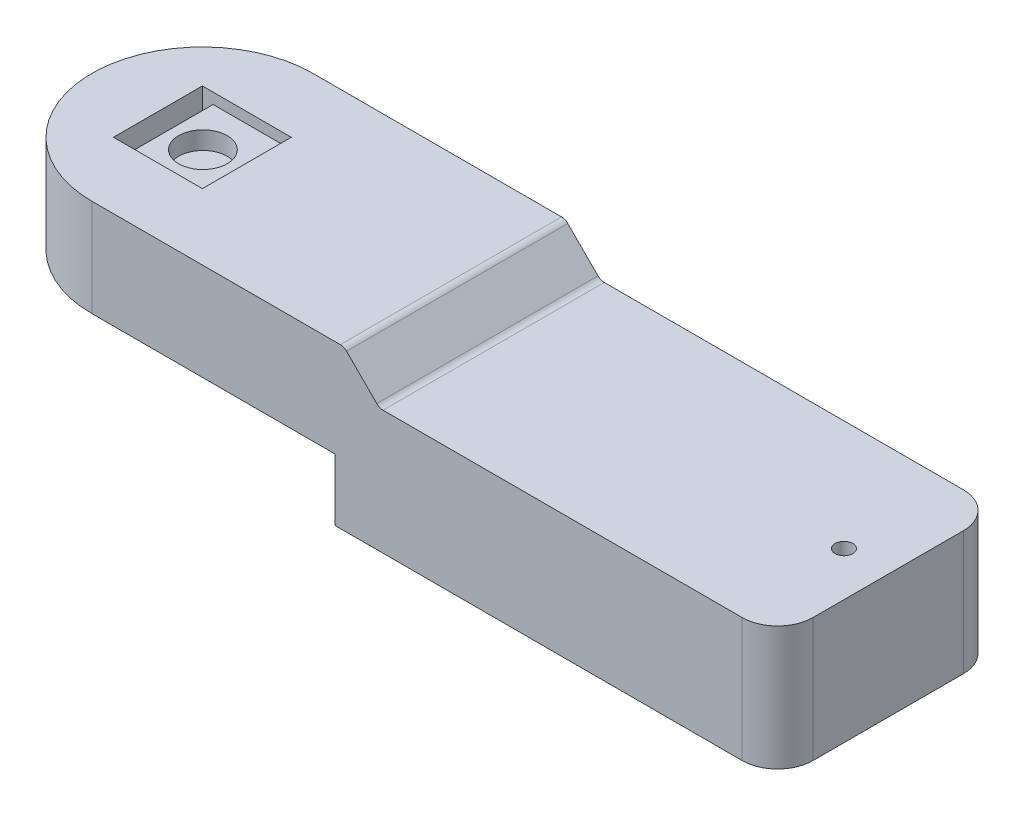
ISO-10303-21;
HEADER;
FILE_DESCRIPTION(('STEP AP214'),'2;1');
FILE_NAME('part.step','',(''),(''),'','','');
FILE_SCHEMA(('AUTOMOTIVE_DESIGN { 1 0 10303 214 1 1 1 1 }'));
ENDSEC;
DATA;
#1=APPLICATION_CONTEXT('core data for automotive mechanical design processes');
#2=APPLICATION_PROTOCOL_DEFINITION('international standard','automotive_design',2000,#1);
#3=PRODUCT_CONTEXT('',#1,'mechanical');
#4=PRODUCT('Part','Part','',(#3));
#5=PRODUCT_RELATED_PRODUCT_CATEGORY('part','',(#4));
#6=PRODUCT_DEFINITION_FORMATION('','',#4);
#7=PRODUCT_DEFINITION_CONTEXT('part definition',#1,'design');
#8=PRODUCT_DEFINITION('design','',#6,#7);
#9=PRODUCT_DEFINITION_SHAPE('','',#8);
#10=(LENGTH_UNIT() NAMED_UNIT(*) SI_UNIT(.MILLI.,.METRE.));
#11=(NAMED_UNIT(*) PLANE_ANGLE_UNIT() SI_UNIT($,.RADIAN.));
#12=(NAMED_UNIT(*) SI_UNIT($,.STERADIAN.) SOLID_ANGLE_UNIT());
#13=UNCERTAINTY_MEASURE_WITH_UNIT(LENGTH_MEASURE(1.E-05),#10,'distance_accuracy_value','');
#14=(GEOMETRIC_REPRESENTATION_CONTEXT(3) GLOBAL_UNCERTAINTY_ASSIGNED_CONTEXT((#13)) GLOBAL_UNIT_ASSIGNED_CONTEXT((#10,
#11,#12)) REPRESENTATION_CONTEXT('',''));
#15=CARTESIAN_POINT('',(0.,0.,0.));
#16=DIRECTION('',(0.,0.,1.));
#17=DIRECTION('',(1.,0.,0.));
#18=AXIS2_PLACEMENT_3D('',#15,#16,#17);
#19=CARTESIAN_POINT('',(-17.5,11.,0.));
#20=DIRECTION('',(0.,-1.,0.));
#21=DIRECTION('',(0.,0.,-1.));
#22=AXIS2_PLACEMENT_3D('',#19,#20,#21);
#23=CYLINDRICAL_SURFACE('',#22,12.5);
#24=DIRECTION('',(0.,-1.,0.));
#25=VECTOR('',#24,1.);
#26=CARTESIAN_POINT('',(-17.5,11.,12.5));
#27=LINE('',#26,#25);
#28=CARTESIAN_POINT('',(-17.5,11.,12.5));
#29=VERTEX_POINT('',#28);
#30=CARTESIAN_POINT('',(-17.5,0.,12.5));
#31=VERTEX_POINT('',#30);
#32=EDGE_CURVE('E296',#29,#31,#27,.T.);
#33=ORIENTED_EDGE('',*,*,#32,.F.);
#34=CARTESIAN_POINT('',(-17.5,11.,0.));
#35=DIRECTION('',(0.,1.,0.));
#36=DIRECTION('',(0.,0.,1.));
#37=AXIS2_PLACEMENT_3D('',#34,#35,#36);
#38=CIRCLE('',#37,12.5);
#39=CARTESIAN_POINT('',(-17.5,11.,-12.5));
#40=VERTEX_POINT('',#39);
#41=EDGE_CURVE('E302',#40,#29,#38,.T.);
#42=ORIENTED_EDGE('',*,*,#41,.F.);
#43=DIRECTION('',(0.,-1.,0.));
#44=VECTOR('',#43,1.);
#45=CARTESIAN_POINT('',(-17.5,11.,-12.5));
#46=LINE('',#45,#44);
#47=CARTESIAN_POINT('',(-17.5,0.,-12.5));
#48=VERTEX_POINT('',#47);
#49=EDGE_CURVE('E299',#48,#40,#46,.F.);
#50=ORIENTED_EDGE('',*,*,#49,.F.);
#51=CARTESIAN_POINT('',(-17.5,0.,0.));
#52=DIRECTION('',(0.,1.,0.));
#53=DIRECTION('',(0.,0.,1.));
#54=AXIS2_PLACEMENT_3D('',#51,#52,#53);
#55=CIRCLE('',#54,12.5);
#56=EDGE_CURVE('E304',#31,#48,#55,.F.);
#57=ORIENTED_EDGE('',*,*,#56,.F.);
#58=EDGE_LOOP('',(#33,#42,#50,#57));
#59=FACE_BOUND('',#58,.T.);
#60=ADVANCED_FACE('F37',(#59),#23,.T.);
#61=CARTESIAN_POINT('',(60.,11.,-12.5));
#62=DIRECTION('',(-1.,0.,0.));
#63=DIRECTION('',(0.,0.,1.));
#64=AXIS2_PLACEMENT_3D('',#61,#62,#63);
#65=PLANE('',#64);
#66=DIRECTION('',(0.,0.,1.));
#67=VECTOR('',#66,1.);
#68=CARTESIAN_POINT('',(60.,-7.,12.5));
#69=LINE('',#68,#67);
#70=CARTESIAN_POINT('',(60.,-7.,-8.5));
#71=VERTEX_POINT('',#70);
#72=CARTESIAN_POINT('',(60.,-7.,8.5));
#73=VERTEX_POINT('',#72);
#74=EDGE_CURVE('E267',#71,#73,#69,.T.);
#75=ORIENTED_EDGE('',*,*,#74,.F.);
#76=DIRECTION('',(0.,-1.,0.));
#77=VECTOR('',#76,1.);
#78=CARTESIAN_POINT('',(60.,11.,-8.5));
#79=LINE('',#78,#77);
#80=CARTESIAN_POINT('',(60.,7.,-8.5));
#81=VERTEX_POINT('',#80);
#82=EDGE_CURVE('E58',#71,#81,#79,.F.);
#83=ORIENTED_EDGE('',*,*,#82,.T.);
#84=DIRECTION('',(0.,0.,-1.));
#85=VECTOR('',#84,1.);
#86=CARTESIAN_POINT('',(60.,7.,12.5));
#87=LINE('',#86,#85);
#88=CARTESIAN_POINT('',(60.,7.,8.5));
#89=VERTEX_POINT('',#88);
#90=EDGE_CURVE('E256',#89,#81,#87,.T.);
#91=ORIENTED_EDGE('',*,*,#90,.F.);
#92=DIRECTION('',(0.,-1.,0.));
#93=VECTOR('',#92,1.);
#94=CARTESIAN_POINT('',(60.,11.,8.5));
#95=LINE('',#94,#93);
#96=EDGE_CURVE('E332',#89,#73,#95,.T.);
#97=ORIENTED_EDGE('',*,*,#96,.T.);
#98=EDGE_LOOP('',(#75,#83,#91,#97));
#99=FACE_BOUND('',#98,.T.);
#100=ADVANCED_FACE('F350',(#99),#65,.F.);
#101=CARTESIAN_POINT('',(0.,0.,0.));
#102=DIRECTION('',(0.,1.,0.));
#103=DIRECTION('',(0.,0.,1.));
#104=AXIS2_PLACEMENT_3D('',#101,#102,#103);
#105=PLANE('',#104);
#106=CARTESIAN_POINT('',(-17.5,0.,0.));
#107=DIRECTION('',(0.,-1.,0.));
#108=DIRECTION('',(0.,0.,-1.));
#109=AXIS2_PLACEMENT_3D('',#106,#107,#108);
#110=CIRCLE('',#109,6.96);
#111=CARTESIAN_POINT('',(-17.5,0.,-6.96));
#112=VERTEX_POINT('',#111);
#113=EDGE_CURVE('E493',#112,#112,#110,.T.);
#114=ORIENTED_EDGE('',*,*,#113,.F.);
#115=EDGE_LOOP('',(#114));
#116=FACE_BOUND('',#115,.T.);
#117=DIRECTION('',(1.,0.,0.));
#118=VECTOR('',#117,1.);
#119=CARTESIAN_POINT('',(-30.,0.,12.5));
#120=LINE('',#119,#118);
#121=CARTESIAN_POINT('',(9.99999999999998,0.,12.5));
#122=VERTEX_POINT('',#121);
#123=EDGE_CURVE('E280',#31,#122,#120,.T.);
#124=ORIENTED_EDGE('',*,*,#123,.F.);
#125=ORIENTED_EDGE('',*,*,#56,.T.);
#126=DIRECTION('',(-1.,0.,0.));
#127=VECTOR('',#126,1.);
#128=CARTESIAN_POINT('',(-30.,0.,-12.5));
#129=LINE('',#128,#127);
#130=CARTESIAN_POINT('',(9.99999999999999,0.,-12.5));
#131=VERTEX_POINT('',#130);
#132=EDGE_CURVE('E285',#131,#48,#129,.T.);
#133=ORIENTED_EDGE('',*,*,#132,.F.);
#134=DIRECTION('',(0.,0.,-1.));
#135=VECTOR('',#134,1.);
#136=CARTESIAN_POINT('',(9.99999999999999,0.,-12.5));
#137=LINE('',#136,#135);
#138=EDGE_CURVE('E260',#122,#131,#137,.T.);
#139=ORIENTED_EDGE('',*,*,#138,.F.);
#140=EDGE_LOOP('',(#124,#125,#133,#139));
#141=FACE_BOUND('',#140,.T.);
#142=ADVANCED_FACE('F365',(#116,#141),#105,.F.);
#143=CARTESIAN_POINT('',(-30.,11.,12.5));
#144=DIRECTION('',(0.,0.,-1.));
#145=DIRECTION('',(-1.,0.,0.));
#146=AXIS2_PLACEMENT_3D('',#143,#144,#145);
#147=PLANE('',#146);
#148=DIRECTION('',(-1.,0.,0.));
#149=VECTOR('',#148,1.);
#150=CARTESIAN_POINT('',(9.99999999999999,-7.,12.5));
#151=LINE('',#150,#149);
#152=CARTESIAN_POINT('',(56.,-7.,12.5));
#153=VERTEX_POINT('',#152);
#154=CARTESIAN_POINT('',(9.99999999999999,-7.,12.5));
#155=VERTEX_POINT('',#154);
#156=EDGE_CURVE('E270',#153,#155,#151,.T.);
#157=ORIENTED_EDGE('',*,*,#156,.F.);
#158=DIRECTION('',(0.,-1.,0.));
#159=VECTOR('',#158,1.);
#160=CARTESIAN_POINT('',(56.,11.,12.5));
#161=LINE('',#160,#159);
#162=CARTESIAN_POINT('',(56.,7.,12.5));
#163=VERTEX_POINT('',#162);
#164=EDGE_CURVE('E11',#153,#163,#161,.F.);
#165=ORIENTED_EDGE('',*,*,#164,.T.);
#166=DIRECTION('',(1.,0.,0.));
#167=VECTOR('',#166,1.);
#168=CARTESIAN_POINT('',(15.,7.,12.5));
#169=LINE('',#168,#167);
#170=CARTESIAN_POINT('',(15.4142135623731,7.,12.5));
#171=VERTEX_POINT('',#170);
#172=EDGE_CURVE('E248',#171,#163,#169,.T.);
#173=ORIENTED_EDGE('',*,*,#172,.F.);
#174=CARTESIAN_POINT('',(15.4142135623731,8.,12.5));
#175=DIRECTION('',(0.,0.,-1.));
#176=DIRECTION('',(-1.,0.,0.));
#177=AXIS2_PLACEMENT_3D('',#174,#175,#176);
#178=CIRCLE('',#177,1.);
#179=CARTESIAN_POINT('',(14.7071067811865,7.29289321881345,12.5));
#180=VERTEX_POINT('',#179);
#181=EDGE_CURVE('E320',#171,#180,#178,.T.);
#182=ORIENTED_EDGE('',*,*,#181,.T.);
#183=DIRECTION('',(-0.707106781186548,0.707106781186547,0.));
#184=VECTOR('',#183,1.);
#185=CARTESIAN_POINT('',(15.,6.99999999999998,12.5));
#186=LINE('',#185,#184);
#187=CARTESIAN_POINT('',(11.2928932188134,10.7071067811865,12.5));
#188=VERTEX_POINT('',#187);
#189=EDGE_CURVE('E287',#180,#188,#186,.T.);
#190=ORIENTED_EDGE('',*,*,#189,.T.);
#191=CARTESIAN_POINT('',(10.5857864376269,10.,12.5));
#192=DIRECTION('',(0.,0.,-1.));
#193=DIRECTION('',(-1.,0.,0.));
#194=AXIS2_PLACEMENT_3D('',#191,#192,#193);
#195=CIRCLE('',#194,1.);
#196=CARTESIAN_POINT('',(10.5857864376269,11.,12.5));
#197=VERTEX_POINT('',#196);
#198=EDGE_CURVE('E318',#188,#197,#195,.F.);
#199=ORIENTED_EDGE('',*,*,#198,.T.);
#200=DIRECTION('',(1.,0.,0.));
#201=VECTOR('',#200,1.);
#202=CARTESIAN_POINT('',(-30.,11.,12.5));
#203=LINE('',#202,#201);
#204=EDGE_CURVE('E281',#29,#197,#203,.T.);
#205=ORIENTED_EDGE('',*,*,#204,.F.);
#206=ORIENTED_EDGE('',*,*,#32,.T.);
#207=ORIENTED_EDGE('',*,*,#123,.T.);
#208=DIRECTION('',(0.,1.,0.));
#209=VECTOR('',#208,1.);
#210=CARTESIAN_POINT('',(9.99999999999999,-7.,12.5));
#211=LINE('',#210,#209);
#212=EDGE_CURVE('E272',#155,#122,#211,.T.);
#213=ORIENTED_EDGE('',*,*,#212,.F.);
#214=EDGE_LOOP('',(#157,#165,#173,#182,#190,#199,#205,#206,#207,#213));
#215=FACE_BOUND('',#214,.T.);
#216=ADVANCED_FACE('F355',(#215),#147,.F.);
#217=CARTESIAN_POINT('',(-30.,11.,-12.5));
#218=DIRECTION('',(0.,0.,1.));
#219=DIRECTION('',(1.,0.,0.));
#220=AXIS2_PLACEMENT_3D('',#217,#218,#219);
#221=PLANE('',#220);
#222=DIRECTION('',(-1.,0.,0.));
#223=VECTOR('',#222,1.);
#224=CARTESIAN_POINT('',(60.,7.,-12.5));
#225=LINE('',#224,#223);
#226=CARTESIAN_POINT('',(56.,7.,-12.5));
#227=VERTEX_POINT('',#226);
#228=CARTESIAN_POINT('',(15.4142135623731,7.,-12.5));
#229=VERTEX_POINT('',#228);
#230=EDGE_CURVE('E258',#227,#229,#225,.T.);
#231=ORIENTED_EDGE('',*,*,#230,.F.);
#232=DIRECTION('',(0.,-1.,0.));
#233=VECTOR('',#232,1.);
#234=CARTESIAN_POINT('',(56.,11.,-12.5));
#235=LINE('',#234,#233);
#236=CARTESIAN_POINT('',(56.,-7.,-12.5));
#237=VERTEX_POINT('',#236);
#238=EDGE_CURVE('E325',#227,#237,#235,.T.);
#239=ORIENTED_EDGE('',*,*,#238,.T.);
#240=DIRECTION('',(1.,0.,0.));
#241=VECTOR('',#240,1.);
#242=CARTESIAN_POINT('',(60.,-7.,-12.5));
#243=LINE('',#242,#241);
#244=CARTESIAN_POINT('',(9.99999999999999,-7.,-12.5));
#245=VERTEX_POINT('',#244);
#246=EDGE_CURVE('E264',#245,#237,#243,.T.);
#247=ORIENTED_EDGE('',*,*,#246,.F.);
#248=DIRECTION('',(0.,1.,0.));
#249=VECTOR('',#248,1.);
#250=CARTESIAN_POINT('',(9.99999999999999,-7.,-12.5));
#251=LINE('',#250,#249);
#252=EDGE_CURVE('E277',#245,#131,#251,.T.);
#253=ORIENTED_EDGE('',*,*,#252,.T.);
#254=ORIENTED_EDGE('',*,*,#132,.T.);
#255=ORIENTED_EDGE('',*,*,#49,.T.);
#256=DIRECTION('',(-1.,0.,0.));
#257=VECTOR('',#256,1.);
#258=CARTESIAN_POINT('',(-30.,11.,-12.5));
#259=LINE('',#258,#257);
#260=CARTESIAN_POINT('',(10.5857864376269,11.,-12.5));
#261=VERTEX_POINT('',#260);
#262=EDGE_CURVE('E284',#261,#40,#259,.T.);
#263=ORIENTED_EDGE('',*,*,#262,.F.);
#264=CARTESIAN_POINT('',(10.5857864376269,10.,-12.5));
#265=DIRECTION('',(0.,0.,1.));
#266=DIRECTION('',(1.,0.,0.));
#267=AXIS2_PLACEMENT_3D('',#264,#265,#266);
#268=CIRCLE('',#267,1.);
#269=CARTESIAN_POINT('',(11.2928932188134,10.7071067811865,-12.5));
#270=VERTEX_POINT('',#269);
#271=EDGE_CURVE('E316',#261,#270,#268,.F.);
#272=ORIENTED_EDGE('',*,*,#271,.T.);
#273=DIRECTION('',(0.707106781186548,-0.707106781186547,0.));
#274=VECTOR('',#273,1.);
#275=CARTESIAN_POINT('',(15.,6.99999999999998,-12.5));
#276=LINE('',#275,#274);
#277=CARTESIAN_POINT('',(14.7071067811865,7.29289321881345,-12.5));
#278=VERTEX_POINT('',#277);
#279=EDGE_CURVE('E293',#270,#278,#276,.T.);
#280=ORIENTED_EDGE('',*,*,#279,.T.);
#281=CARTESIAN_POINT('',(15.4142135623731,8.,-12.5));
#282=DIRECTION('',(0.,0.,1.));
#283=DIRECTION('',(1.,0.,0.));
#284=AXIS2_PLACEMENT_3D('',#281,#282,#283);
#285=CIRCLE('',#284,1.);
#286=EDGE_CURVE('E322',#278,#229,#285,.T.);
#287=ORIENTED_EDGE('',*,*,#286,.T.);
#288=EDGE_LOOP('',(#231,#239,#247,#253,#254,#255,#263,#272,#280,#287));
#289=FACE_BOUND('',#288,.T.);
#290=ADVANCED_FACE('F344',(#289),#221,.F.);
#291=CARTESIAN_POINT('',(0.,11.,0.));
#292=DIRECTION('',(0.,1.,0.));
#293=DIRECTION('',(0.,0.,1.));
#294=AXIS2_PLACEMENT_3D('',#291,#292,#293);
#295=PLANE('',#294);
#296=DIRECTION('',(0.,0.,1.));
#297=VECTOR('',#296,1.);
#298=CARTESIAN_POINT('',(-22.525,11.,-5.025));
#299=LINE('',#298,#297);
#300=CARTESIAN_POINT('',(-22.525,11.,-5.025));
#301=VERTEX_POINT('',#300);
#302=CARTESIAN_POINT('',(-22.525,11.,5.025));
#303=VERTEX_POINT('',#302);
#304=EDGE_CURVE('E211',#301,#303,#299,.T.);
#305=ORIENTED_EDGE('',*,*,#304,.F.);
#306=DIRECTION('',(-1.,0.,0.));
#307=VECTOR('',#306,1.);
#308=CARTESIAN_POINT('',(-22.525,11.,-5.025));
#309=LINE('',#308,#307);
#310=CARTESIAN_POINT('',(-12.475,11.,-5.025));
#311=VERTEX_POINT('',#310);
#312=EDGE_CURVE('E235',#311,#301,#309,.T.);
#313=ORIENTED_EDGE('',*,*,#312,.F.);
#314=DIRECTION('',(0.,0.,-1.));
#315=VECTOR('',#314,1.);
#316=CARTESIAN_POINT('',(-12.475,11.,-5.025));
#317=LINE('',#316,#315);
#318=CARTESIAN_POINT('',(-12.475,11.,5.025));
#319=VERTEX_POINT('',#318);
#320=EDGE_CURVE('E242',#319,#311,#317,.T.);
#321=ORIENTED_EDGE('',*,*,#320,.F.);
#322=DIRECTION('',(1.,0.,0.));
#323=VECTOR('',#322,1.);
#324=CARTESIAN_POINT('',(-22.525,11.,5.025));
#325=LINE('',#324,#323);
#326=EDGE_CURVE('E239',#303,#319,#325,.T.);
#327=ORIENTED_EDGE('',*,*,#326,.F.);
#328=EDGE_LOOP('',(#305,#313,#321,#327));
#329=FACE_BOUND('',#328,.T.);
#330=ORIENTED_EDGE('',*,*,#204,.T.);
#331=DIRECTION('',(0.,0.,-1.));
#332=VECTOR('',#331,1.);
#333=CARTESIAN_POINT('',(10.5857864376269,11.,0.));
#334=LINE('',#333,#332);
#335=EDGE_CURVE('E313',#197,#261,#334,.T.);
#336=ORIENTED_EDGE('',*,*,#335,.T.);
#337=ORIENTED_EDGE('',*,*,#262,.T.);
#338=ORIENTED_EDGE('',*,*,#41,.T.);
#339=EDGE_LOOP('',(#330,#336,#337,#338));
#340=FACE_BOUND('',#339,.T.);
#341=ADVANCED_FACE('F371',(#329,#340),#295,.T.);
#342=CARTESIAN_POINT('',(9.99999999999999,-7.,-12.5));
#343=DIRECTION('',(1.,0.,0.));
#344=DIRECTION('',(0.,0.,-1.));
#345=AXIS2_PLACEMENT_3D('',#342,#343,#344);
#346=PLANE('',#345);
#347=ORIENTED_EDGE('',*,*,#138,.T.);
#348=ORIENTED_EDGE('',*,*,#252,.F.);
#349=DIRECTION('',(0.,0.,-1.));
#350=VECTOR('',#349,1.);
#351=CARTESIAN_POINT('',(9.99999999999999,-7.,-12.5));
#352=LINE('',#351,#350);
#353=EDGE_CURVE('E261',#155,#245,#352,.T.);
#354=ORIENTED_EDGE('',*,*,#353,.F.);
#355=ORIENTED_EDGE('',*,*,#212,.T.);
#356=EDGE_LOOP('',(#347,#348,#354,#355));
#357=FACE_BOUND('',#356,.T.);
#358=ADVANCED_FACE('F361',(#357),#346,.F.);
#359=CARTESIAN_POINT('',(0.,-7.,0.));
#360=DIRECTION('',(0.,1.,0.));
#361=DIRECTION('',(0.,0.,1.));
#362=AXIS2_PLACEMENT_3D('',#359,#360,#361);
#363=PLANE('',#362);
#364=CARTESIAN_POINT('',(55.,-7.,0.));
#365=DIRECTION('',(0.,1.,0.));
#366=DIRECTION('',(0.,0.,1.));
#367=AXIS2_PLACEMENT_3D('',#364,#365,#366);
#368=CIRCLE('',#367,0.999999999999998);
#369=CARTESIAN_POINT('',(55.,-7.,0.999999999999998));
#370=VERTEX_POINT('',#369);
#371=EDGE_CURVE('E482',#370,#370,#368,.T.);
#372=ORIENTED_EDGE('',*,*,#371,.T.);
#373=EDGE_LOOP('',(#372));
#374=FACE_BOUND('',#373,.T.);
#375=ORIENTED_EDGE('',*,*,#246,.T.);
#376=CARTESIAN_POINT('',(56.,-7.,-8.5));
#377=DIRECTION('',(0.,1.,0.));
#378=DIRECTION('',(0.,0.,1.));
#379=AXIS2_PLACEMENT_3D('',#376,#377,#378);
#380=CIRCLE('',#379,4.);
#381=EDGE_CURVE('E330',#237,#71,#380,.F.);
#382=ORIENTED_EDGE('',*,*,#381,.T.);
#383=ORIENTED_EDGE('',*,*,#74,.T.);
#384=CARTESIAN_POINT('',(56.,-7.,8.5));
#385=DIRECTION('',(0.,1.,0.));
#386=DIRECTION('',(0.,0.,1.));
#387=AXIS2_PLACEMENT_3D('',#384,#385,#386);
#388=CIRCLE('',#387,4.);
#389=EDGE_CURVE('E328',#73,#153,#388,.F.);
#390=ORIENTED_EDGE('',*,*,#389,.T.);
#391=ORIENTED_EDGE('',*,*,#156,.T.);
#392=ORIENTED_EDGE('',*,*,#353,.T.);
#393=EDGE_LOOP('',(#375,#382,#383,#390,#391,#392));
#394=FACE_BOUND('',#393,.T.);
#395=ADVANCED_FACE('F349',(#374,#394),#363,.F.);
#396=CARTESIAN_POINT('',(0.,7.,0.));
#397=DIRECTION('',(0.,1.,0.));
#398=DIRECTION('',(0.,0.,1.));
#399=AXIS2_PLACEMENT_3D('',#396,#397,#398);
#400=PLANE('',#399);
#401=CARTESIAN_POINT('',(55.,7.,0.));
#402=DIRECTION('',(0.,1.,0.));
#403=DIRECTION('',(0.,0.,1.));
#404=AXIS2_PLACEMENT_3D('',#401,#402,#403);
#405=CIRCLE('',#404,0.999999999999998);
#406=CARTESIAN_POINT('',(55.,7.,0.999999999999998));
#407=VERTEX_POINT('',#406);
#408=EDGE_CURVE('E485',#407,#407,#405,.T.);
#409=ORIENTED_EDGE('',*,*,#408,.F.);
#410=EDGE_LOOP('',(#409));
#411=FACE_BOUND('',#410,.T.);
#412=ORIENTED_EDGE('',*,*,#90,.T.);
#413=CARTESIAN_POINT('',(56.,7.,-8.5));
#414=DIRECTION('',(0.,1.,0.));
#415=DIRECTION('',(0.,0.,1.));
#416=AXIS2_PLACEMENT_3D('',#413,#414,#415);
#417=CIRCLE('',#416,4.);
#418=EDGE_CURVE('E45',#81,#227,#417,.T.);
#419=ORIENTED_EDGE('',*,*,#418,.T.);
#420=ORIENTED_EDGE('',*,*,#230,.T.);
#421=DIRECTION('',(0.,0.,1.));
#422=VECTOR('',#421,1.);
#423=CARTESIAN_POINT('',(15.4142135623731,7.,12.5));
#424=LINE('',#423,#422);
#425=EDGE_CURVE('E306',#229,#171,#424,.T.);
#426=ORIENTED_EDGE('',*,*,#425,.T.);
#427=ORIENTED_EDGE('',*,*,#172,.T.);
#428=CARTESIAN_POINT('',(56.,7.,8.5));
#429=DIRECTION('',(0.,1.,0.));
#430=DIRECTION('',(0.,0.,1.));
#431=AXIS2_PLACEMENT_3D('',#428,#429,#430);
#432=CIRCLE('',#431,4.);
#433=EDGE_CURVE('E336',#163,#89,#432,.T.);
#434=ORIENTED_EDGE('',*,*,#433,.T.);
#435=EDGE_LOOP('',(#412,#419,#420,#426,#427,#434));
#436=FACE_BOUND('',#435,.T.);
#437=ADVANCED_FACE('F340',(#411,#436),#400,.T.);
#438=CARTESIAN_POINT('',(-22.525,9.79,-5.025));
#439=DIRECTION('',(-1.,0.,0.));
#440=DIRECTION('',(0.,0.,1.));
#441=AXIS2_PLACEMENT_3D('',#438,#439,#440);
#442=PLANE('',#441);
#443=ORIENTED_EDGE('',*,*,#304,.T.);
#444=DIRECTION('',(0.,1.,0.));
#445=VECTOR('',#444,1.);
#446=CARTESIAN_POINT('',(-22.525,9.79,5.025));
#447=LINE('',#446,#445);
#448=CARTESIAN_POINT('',(-22.525,7.77,5.025));
#449=VERTEX_POINT('',#448);
#450=EDGE_CURVE('E237',#449,#303,#447,.T.);
#451=ORIENTED_EDGE('',*,*,#450,.F.);
#452=DIRECTION('',(0.,0.,1.));
#453=VECTOR('',#452,1.);
#454=CARTESIAN_POINT('',(-22.525,7.77,5.025));
#455=LINE('',#454,#453);
#456=CARTESIAN_POINT('',(-22.525,7.77,-5.025));
#457=VERTEX_POINT('',#456);
#458=EDGE_CURVE('E213',#457,#449,#455,.T.);
#459=ORIENTED_EDGE('',*,*,#458,.F.);
#460=DIRECTION('',(0.,1.,0.));
#461=VECTOR('',#460,1.);
#462=CARTESIAN_POINT('',(-22.525,9.79,-5.025));
#463=LINE('',#462,#461);
#464=EDGE_CURVE('E246',#457,#301,#463,.T.);
#465=ORIENTED_EDGE('',*,*,#464,.T.);
#466=EDGE_LOOP('',(#443,#451,#459,#465));
#467=FACE_BOUND('',#466,.T.);
#468=ADVANCED_FACE('F420',(#467),#442,.F.);
#469=CARTESIAN_POINT('',(-22.525,9.79,-5.025));
#470=DIRECTION('',(0.,0.,-1.));
#471=DIRECTION('',(-1.,0.,0.));
#472=AXIS2_PLACEMENT_3D('',#469,#470,#471);
#473=PLANE('',#472);
#474=ORIENTED_EDGE('',*,*,#312,.T.);
#475=ORIENTED_EDGE('',*,*,#464,.F.);
#476=DIRECTION('',(-1.,0.,0.));
#477=VECTOR('',#476,1.);
#478=CARTESIAN_POINT('',(-22.525,7.77,-5.025));
#479=LINE('',#478,#477);
#480=CARTESIAN_POINT('',(-21.315,7.77,-5.025));
#481=VERTEX_POINT('',#480);
#482=EDGE_CURVE('E223',#481,#457,#479,.T.);
#483=ORIENTED_EDGE('',*,*,#482,.F.);
#484=DIRECTION('',(0.,1.,0.));
#485=VECTOR('',#484,1.);
#486=CARTESIAN_POINT('',(-21.315,7.77,-5.025));
#487=LINE('',#486,#485);
#488=CARTESIAN_POINT('',(-21.315,9.79,-5.025));
#489=VERTEX_POINT('',#488);
#490=EDGE_CURVE('E203',#481,#489,#487,.T.);
#491=ORIENTED_EDGE('',*,*,#490,.T.);
#492=DIRECTION('',(-1.,0.,0.));
#493=VECTOR('',#492,1.);
#494=CARTESIAN_POINT('',(-22.525,9.79,-5.025));
#495=LINE('',#494,#493);
#496=CARTESIAN_POINT('',(-13.685,9.79,-5.025));
#497=VERTEX_POINT('',#496);
#498=EDGE_CURVE('E184',#497,#489,#495,.T.);
#499=ORIENTED_EDGE('',*,*,#498,.F.);
#500=DIRECTION('',(0.,1.,0.));
#501=VECTOR('',#500,1.);
#502=CARTESIAN_POINT('',(-13.685,7.77,-5.025));
#503=LINE('',#502,#501);
#504=CARTESIAN_POINT('',(-13.685,7.77,-5.025));
#505=VERTEX_POINT('',#504);
#506=EDGE_CURVE('E176',#505,#497,#503,.T.);
#507=ORIENTED_EDGE('',*,*,#506,.F.);
#508=DIRECTION('',(-1.,0.,0.));
#509=VECTOR('',#508,1.);
#510=CARTESIAN_POINT('',(-12.475,7.77,-5.025));
#511=LINE('',#510,#509);
#512=CARTESIAN_POINT('',(-12.475,7.77,-5.025));
#513=VERTEX_POINT('',#512);
#514=EDGE_CURVE('E181',#513,#505,#511,.T.);
#515=ORIENTED_EDGE('',*,*,#514,.F.);
#516=DIRECTION('',(0.,1.,0.));
#517=VECTOR('',#516,1.);
#518=CARTESIAN_POINT('',(-12.475,9.79,-5.025));
#519=LINE('',#518,#517);
#520=EDGE_CURVE('E249',#513,#311,#519,.T.);
#521=ORIENTED_EDGE('',*,*,#520,.T.);
#522=EDGE_LOOP('',(#474,#475,#483,#491,#499,#507,#515,#521));
#523=FACE_BOUND('',#522,.T.);
#524=ADVANCED_FACE('F179',(#523),#473,.F.);
#525=CARTESIAN_POINT('',(-12.475,9.79,-5.025));
#526=DIRECTION('',(1.,0.,0.));
#527=DIRECTION('',(0.,0.,-1.));
#528=AXIS2_PLACEMENT_3D('',#525,#526,#527);
#529=PLANE('',#528);
#530=ORIENTED_EDGE('',*,*,#320,.T.);
#531=ORIENTED_EDGE('',*,*,#520,.F.);
#532=DIRECTION('',(0.,0.,-1.));
#533=VECTOR('',#532,1.);
#534=CARTESIAN_POINT('',(-12.475,7.77,5.025));
#535=LINE('',#534,#533);
#536=CARTESIAN_POINT('',(-12.475,7.77,5.025));
#537=VERTEX_POINT('',#536);
#538=EDGE_CURVE('E189',#537,#513,#535,.T.);
#539=ORIENTED_EDGE('',*,*,#538,.F.);
#540=DIRECTION('',(0.,1.,0.));
#541=VECTOR('',#540,1.);
#542=CARTESIAN_POINT('',(-12.475,9.79,5.025));
#543=LINE('',#542,#541);
#544=EDGE_CURVE('E251',#537,#319,#543,.T.);
#545=ORIENTED_EDGE('',*,*,#544,.T.);
#546=EDGE_LOOP('',(#530,#531,#539,#545));
#547=FACE_BOUND('',#546,.T.);
#548=ADVANCED_FACE('F429',(#547),#529,.F.);
#549=CARTESIAN_POINT('',(-22.525,9.79,5.025));
#550=DIRECTION('',(0.,0.,1.));
#551=DIRECTION('',(1.,0.,0.));
#552=AXIS2_PLACEMENT_3D('',#549,#550,#551);
#553=PLANE('',#552);
#554=ORIENTED_EDGE('',*,*,#326,.T.);
#555=ORIENTED_EDGE('',*,*,#544,.F.);
#556=DIRECTION('',(1.,0.,0.));
#557=VECTOR('',#556,1.);
#558=CARTESIAN_POINT('',(-13.685,7.77,5.025));
#559=LINE('',#558,#557);
#560=CARTESIAN_POINT('',(-13.685,7.77,5.025));
#561=VERTEX_POINT('',#560);
#562=EDGE_CURVE('E197',#561,#537,#559,.T.);
#563=ORIENTED_EDGE('',*,*,#562,.F.);
#564=DIRECTION('',(0.,1.,0.));
#565=VECTOR('',#564,1.);
#566=CARTESIAN_POINT('',(-13.685,7.77,5.025));
#567=LINE('',#566,#565);
#568=CARTESIAN_POINT('',(-13.685,9.79,5.025));
#569=VERTEX_POINT('',#568);
#570=EDGE_CURVE('E188',#561,#569,#567,.T.);
#571=ORIENTED_EDGE('',*,*,#570,.T.);
#572=DIRECTION('',(1.,0.,0.));
#573=VECTOR('',#572,1.);
#574=CARTESIAN_POINT('',(-22.525,9.79,5.025));
#575=LINE('',#574,#573);
#576=CARTESIAN_POINT('',(-21.315,9.79,5.025));
#577=VERTEX_POINT('',#576);
#578=EDGE_CURVE('E232',#577,#569,#575,.T.);
#579=ORIENTED_EDGE('',*,*,#578,.F.);
#580=DIRECTION('',(0.,1.,0.));
#581=VECTOR('',#580,1.);
#582=CARTESIAN_POINT('',(-21.315,7.77,5.025));
#583=LINE('',#582,#581);
#584=CARTESIAN_POINT('',(-21.315,7.77,5.025));
#585=VERTEX_POINT('',#584);
#586=EDGE_CURVE('E226',#585,#577,#583,.T.);
#587=ORIENTED_EDGE('',*,*,#586,.F.);
#588=DIRECTION('',(1.,0.,0.));
#589=VECTOR('',#588,1.);
#590=CARTESIAN_POINT('',(-21.315,7.77,5.025));
#591=LINE('',#590,#589);
#592=EDGE_CURVE('E216',#449,#585,#591,.T.);
#593=ORIENTED_EDGE('',*,*,#592,.F.);
#594=ORIENTED_EDGE('',*,*,#450,.T.);
#595=EDGE_LOOP('',(#554,#555,#563,#571,#579,#587,#593,#594));
#596=FACE_BOUND('',#595,.T.);
#597=ADVANCED_FACE('F425',(#596),#553,.F.);
#598=CARTESIAN_POINT('',(0.,9.79,0.));
#599=DIRECTION('',(0.,1.,0.));
#600=DIRECTION('',(0.,0.,1.));
#601=AXIS2_PLACEMENT_3D('',#598,#599,#600);
#602=PLANE('',#601);
#603=CARTESIAN_POINT('',(-17.465,9.79,-0.0250000000000007));
#604=DIRECTION('',(0.,1.,0.));
#605=DIRECTION('',(0.,0.,1.));
#606=AXIS2_PLACEMENT_3D('',#603,#604,#605);
#607=CIRCLE('',#606,2.75);
#608=CARTESIAN_POINT('',(-17.465,9.79,2.725));
#609=VERTEX_POINT('',#608);
#610=EDGE_CURVE('E206',#609,#609,#607,.T.);
#611=ORIENTED_EDGE('',*,*,#610,.F.);
#612=EDGE_LOOP('',(#611));
#613=FACE_BOUND('',#612,.T.);
#614=DIRECTION('',(0.,0.,1.));
#615=VECTOR('',#614,1.);
#616=CARTESIAN_POINT('',(-13.685,9.79,-5.025));
#617=LINE('',#616,#615);
#618=EDGE_CURVE('E201',#497,#569,#617,.T.);
#619=ORIENTED_EDGE('',*,*,#618,.F.);
#620=ORIENTED_EDGE('',*,*,#498,.T.);
#621=DIRECTION('',(0.,0.,-1.));
#622=VECTOR('',#621,1.);
#623=CARTESIAN_POINT('',(-21.315,9.79,-5.025));
#624=LINE('',#623,#622);
#625=EDGE_CURVE('E217',#577,#489,#624,.T.);
#626=ORIENTED_EDGE('',*,*,#625,.F.);
#627=ORIENTED_EDGE('',*,*,#578,.T.);
#628=EDGE_LOOP('',(#619,#620,#626,#627));
#629=FACE_BOUND('',#628,.T.);
#630=ADVANCED_FACE('F428',(#613,#629),#602,.T.);
#631=CARTESIAN_POINT('',(-21.315,7.77,-5.025));
#632=DIRECTION('',(1.,0.,0.));
#633=DIRECTION('',(0.,0.,-1.));
#634=AXIS2_PLACEMENT_3D('',#631,#632,#633);
#635=PLANE('',#634);
#636=ORIENTED_EDGE('',*,*,#625,.T.);
#637=ORIENTED_EDGE('',*,*,#490,.F.);
#638=DIRECTION('',(0.,0.,-1.));
#639=VECTOR('',#638,1.);
#640=CARTESIAN_POINT('',(-21.315,7.77,-5.025));
#641=LINE('',#640,#639);
#642=EDGE_CURVE('E220',#585,#481,#641,.T.);
#643=ORIENTED_EDGE('',*,*,#642,.F.);
#644=ORIENTED_EDGE('',*,*,#586,.T.);
#645=EDGE_LOOP('',(#636,#637,#643,#644));
#646=FACE_BOUND('',#645,.T.);
#647=ADVANCED_FACE('F438',(#646),#635,.F.);
#648=CARTESIAN_POINT('',(0.,7.77,0.));
#649=DIRECTION('',(0.,-1.,0.));
#650=DIRECTION('',(0.,0.,-1.));
#651=AXIS2_PLACEMENT_3D('',#648,#649,#650);
#652=PLANE('',#651);
#653=ORIENTED_EDGE('',*,*,#458,.T.);
#654=ORIENTED_EDGE('',*,*,#592,.T.);
#655=ORIENTED_EDGE('',*,*,#642,.T.);
#656=ORIENTED_EDGE('',*,*,#482,.T.);
#657=EDGE_LOOP('',(#653,#654,#655,#656));
#658=FACE_BOUND('',#657,.T.);
#659=ADVANCED_FACE('F442',(#658),#652,.F.);
#660=CARTESIAN_POINT('',(-13.685,7.77,-5.025));
#661=DIRECTION('',(-1.,0.,0.));
#662=DIRECTION('',(0.,0.,1.));
#663=AXIS2_PLACEMENT_3D('',#660,#661,#662);
#664=PLANE('',#663);
#665=ORIENTED_EDGE('',*,*,#618,.T.);
#666=ORIENTED_EDGE('',*,*,#570,.F.);
#667=DIRECTION('',(0.,0.,1.));
#668=VECTOR('',#667,1.);
#669=CARTESIAN_POINT('',(-13.685,7.77,-5.025));
#670=LINE('',#669,#668);
#671=EDGE_CURVE('E192',#505,#561,#670,.T.);
#672=ORIENTED_EDGE('',*,*,#671,.F.);
#673=ORIENTED_EDGE('',*,*,#506,.T.);
#674=EDGE_LOOP('',(#665,#666,#672,#673));
#675=FACE_BOUND('',#674,.T.);
#676=ADVANCED_FACE('F193',(#675),#664,.F.);
#677=CARTESIAN_POINT('',(0.,7.77,0.));
#678=DIRECTION('',(0.,1.,0.));
#679=DIRECTION('',(0.,0.,1.));
#680=AXIS2_PLACEMENT_3D('',#677,#678,#679);
#681=PLANE('',#680);
#682=ORIENTED_EDGE('',*,*,#514,.T.);
#683=ORIENTED_EDGE('',*,*,#671,.T.);
#684=ORIENTED_EDGE('',*,*,#562,.T.);
#685=ORIENTED_EDGE('',*,*,#538,.T.);
#686=EDGE_LOOP('',(#682,#683,#684,#685));
#687=FACE_BOUND('',#686,.T.);
#688=ADVANCED_FACE('F199',(#687),#681,.T.);
#689=CARTESIAN_POINT('',(-17.465,7.77,-0.0250000000000007));
#690=DIRECTION('',(0.,1.,0.));
#691=DIRECTION('',(0.,0.,1.));
#692=AXIS2_PLACEMENT_3D('',#689,#690,#691);
#693=CYLINDRICAL_SURFACE('',#692,2.75);
#694=CARTESIAN_POINT('',(-17.465,7.77,-0.0250000000000007));
#695=DIRECTION('',(0.,1.,0.));
#696=DIRECTION('',(0.,0.,1.));
#697=AXIS2_PLACEMENT_3D('',#694,#695,#696);
#698=CIRCLE('',#697,2.75);
#699=CARTESIAN_POINT('',(-17.465,7.77,2.725));
#700=VERTEX_POINT('',#699);
#701=EDGE_CURVE('E229',#700,#700,#698,.T.);
#702=ORIENTED_EDGE('',*,*,#701,.F.);
#703=EDGE_LOOP('',(#702));
#704=FACE_BOUND('',#703,.T.);
#705=ORIENTED_EDGE('',*,*,#610,.T.);
#706=EDGE_LOOP('',(#705));
#707=FACE_BOUND('',#706,.T.);
#708=ADVANCED_FACE('F451',(#704,#707),#693,.F.);
#709=CARTESIAN_POINT('',(-17.465,7.77,-0.0250000000000007));
#710=DIRECTION('',(0.,1.,0.));
#711=DIRECTION('',(0.,0.,1.));
#712=AXIS2_PLACEMENT_3D('',#709,#710,#711);
#713=PLANE('',#712);
#714=ORIENTED_EDGE('',*,*,#701,.T.);
#715=EDGE_LOOP('',(#714));
#716=FACE_BOUND('',#715,.T.);
#717=ADVANCED_FACE('F391',(#716),#713,.T.);
#718=CARTESIAN_POINT('',(15.,6.99999999999998,-12.5));
#719=DIRECTION('',(0.707106781186547,0.707106781186548,0.));
#720=DIRECTION('',(0.,0.,-1.));
#721=AXIS2_PLACEMENT_3D('',#718,#719,#720);
#722=PLANE('',#721);
#723=ORIENTED_EDGE('',*,*,#189,.F.);
#724=DIRECTION('',(0.,0.,1.));
#725=VECTOR('',#724,1.);
#726=CARTESIAN_POINT('',(14.7071067811865,7.29289321881345,-12.5));
#727=LINE('',#726,#725);
#728=EDGE_CURVE('E311',#180,#278,#727,.F.);
#729=ORIENTED_EDGE('',*,*,#728,.T.);
#730=ORIENTED_EDGE('',*,*,#279,.F.);
#731=DIRECTION('',(0.,0.,-1.));
#732=VECTOR('',#731,1.);
#733=CARTESIAN_POINT('',(11.2928932188134,10.7071067811865,-12.5));
#734=LINE('',#733,#732);
#735=EDGE_CURVE('E309',#270,#188,#734,.F.);
#736=ORIENTED_EDGE('',*,*,#735,.T.);
#737=EDGE_LOOP('',(#723,#729,#730,#736));
#738=FACE_BOUND('',#737,.T.);
#739=ADVANCED_FACE('F378',(#738),#722,.T.);
#740=CARTESIAN_POINT('',(15.4142135623731,8.,0.));
#741=DIRECTION('',(0.,0.,-1.));
#742=DIRECTION('',(-1.,0.,0.));
#743=AXIS2_PLACEMENT_3D('',#740,#741,#742);
#744=CYLINDRICAL_SURFACE('',#743,1.);
#745=ORIENTED_EDGE('',*,*,#286,.F.);
#746=ORIENTED_EDGE('',*,*,#728,.F.);
#747=ORIENTED_EDGE('',*,*,#181,.F.);
#748=ORIENTED_EDGE('',*,*,#425,.F.);
#749=EDGE_LOOP('',(#745,#746,#747,#748));
#750=FACE_BOUND('',#749,.T.);
#751=ADVANCED_FACE('F383',(#750),#744,.F.);
#752=CARTESIAN_POINT('',(10.5857864376269,10.,0.));
#753=DIRECTION('',(0.,0.,-1.));
#754=DIRECTION('',(-1.,0.,0.));
#755=AXIS2_PLACEMENT_3D('',#752,#753,#754);
#756=CYLINDRICAL_SURFACE('',#755,1.);
#757=ORIENTED_EDGE('',*,*,#198,.F.);
#758=ORIENTED_EDGE('',*,*,#735,.F.);
#759=ORIENTED_EDGE('',*,*,#271,.F.);
#760=ORIENTED_EDGE('',*,*,#335,.F.);
#761=EDGE_LOOP('',(#757,#758,#759,#760));
#762=FACE_BOUND('',#761,.T.);
#763=ADVANCED_FACE('F381',(#762),#756,.T.);
#764=CARTESIAN_POINT('',(56.,11.,-8.5));
#765=DIRECTION('',(0.,-1.,0.));
#766=DIRECTION('',(0.,0.,-1.));
#767=AXIS2_PLACEMENT_3D('',#764,#765,#766);
#768=CYLINDRICAL_SURFACE('',#767,4.);
#769=ORIENTED_EDGE('',*,*,#418,.F.);
#770=ORIENTED_EDGE('',*,*,#82,.F.);
#771=ORIENTED_EDGE('',*,*,#381,.F.);
#772=ORIENTED_EDGE('',*,*,#238,.F.);
#773=EDGE_LOOP('',(#769,#770,#771,#772));
#774=FACE_BOUND('',#773,.T.);
#775=ADVANCED_FACE('F347',(#774),#768,.T.);
#776=CARTESIAN_POINT('',(56.,11.,8.5));
#777=DIRECTION('',(0.,-1.,0.));
#778=DIRECTION('',(0.,0.,-1.));
#779=AXIS2_PLACEMENT_3D('',#776,#777,#778);
#780=CYLINDRICAL_SURFACE('',#779,4.);
#781=ORIENTED_EDGE('',*,*,#433,.F.);
#782=ORIENTED_EDGE('',*,*,#164,.F.);
#783=ORIENTED_EDGE('',*,*,#389,.F.);
#784=ORIENTED_EDGE('',*,*,#96,.F.);
#785=EDGE_LOOP('',(#781,#782,#783,#784));
#786=FACE_BOUND('',#785,.T.);
#787=ADVANCED_FACE('F39',(#786),#780,.T.);
#788=CARTESIAN_POINT('',(-17.5,1.1,0.));
#789=DIRECTION('',(0.,-1.,0.));
#790=DIRECTION('',(0.,0.,-1.));
#791=AXIS2_PLACEMENT_3D('',#788,#789,#790);
#792=CYLINDRICAL_SURFACE('',#791,6.96);
#793=CARTESIAN_POINT('',(-17.5,1.1,0.));
#794=DIRECTION('',(0.,-1.,0.));
#795=DIRECTION('',(0.,0.,-1.));
#796=AXIS2_PLACEMENT_3D('',#793,#794,#795);
#797=CIRCLE('',#796,6.96);
#798=CARTESIAN_POINT('',(-17.5,1.1,-6.96));
#799=VERTEX_POINT('',#798);
#800=EDGE_CURVE('E496',#799,#799,#797,.T.);
#801=ORIENTED_EDGE('',*,*,#800,.F.);
#802=EDGE_LOOP('',(#801));
#803=FACE_BOUND('',#802,.T.);
#804=ORIENTED_EDGE('',*,*,#113,.T.);
#805=EDGE_LOOP('',(#804));
#806=FACE_BOUND('',#805,.T.);
#807=ADVANCED_FACE('F458',(#803,#806),#792,.F.);
#808=CARTESIAN_POINT('',(-17.5,1.1,0.));
#809=DIRECTION('',(0.,-1.,0.));
#810=DIRECTION('',(0.,0.,-1.));
#811=AXIS2_PLACEMENT_3D('',#808,#809,#810);
#812=PLANE('',#811);
#813=CARTESIAN_POINT('',(-17.5,1.1,0.));
#814=DIRECTION('',(0.,-1.,0.));
#815=DIRECTION('',(0.,0.,-1.));
#816=AXIS2_PLACEMENT_3D('',#813,#814,#815);
#817=CIRCLE('',#816,6.4);
#818=CARTESIAN_POINT('',(-17.5,1.1,-6.4));
#819=VERTEX_POINT('',#818);
#820=EDGE_CURVE('E487',#819,#819,#817,.T.);
#821=ORIENTED_EDGE('',*,*,#820,.F.);
#822=EDGE_LOOP('',(#821));
#823=FACE_BOUND('',#822,.T.);
#824=ORIENTED_EDGE('',*,*,#800,.T.);
#825=EDGE_LOOP('',(#824));
#826=FACE_BOUND('',#825,.T.);
#827=ADVANCED_FACE('F461',(#823,#826),#812,.T.);
#828=CARTESIAN_POINT('',(-17.5,4.7,0.));
#829=DIRECTION('',(0.,-1.,0.));
#830=DIRECTION('',(0.,0.,-1.));
#831=AXIS2_PLACEMENT_3D('',#828,#829,#830);
#832=CYLINDRICAL_SURFACE('',#831,6.4);
#833=CARTESIAN_POINT('',(-17.5,4.7,0.));
#834=DIRECTION('',(0.,-1.,0.));
#835=DIRECTION('',(0.,0.,-1.));
#836=AXIS2_PLACEMENT_3D('',#833,#834,#835);
#837=CIRCLE('',#836,6.4);
#838=CARTESIAN_POINT('',(-17.5,4.7,-6.4));
#839=VERTEX_POINT('',#838);
#840=EDGE_CURVE('E490',#839,#839,#837,.T.);
#841=ORIENTED_EDGE('',*,*,#840,.F.);
#842=EDGE_LOOP('',(#841));
#843=FACE_BOUND('',#842,.T.);
#844=ORIENTED_EDGE('',*,*,#820,.T.);
#845=EDGE_LOOP('',(#844));
#846=FACE_BOUND('',#845,.T.);
#847=ADVANCED_FACE('F465',(#843,#846),#832,.F.);
#848=CARTESIAN_POINT('',(-17.5,4.7,0.));
#849=DIRECTION('',(0.,-1.,0.));
#850=DIRECTION('',(0.,0.,-1.));
#851=AXIS2_PLACEMENT_3D('',#848,#849,#850);
#852=PLANE('',#851);
#853=ORIENTED_EDGE('',*,*,#840,.T.);
#854=EDGE_LOOP('',(#853));
#855=FACE_BOUND('',#854,.T.);
#856=ADVANCED_FACE('F469',(#855),#852,.T.);
#857=CARTESIAN_POINT('',(55.,-7.,0.));
#858=DIRECTION('',(0.,1.,0.));
#859=DIRECTION('',(0.,0.,1.));
#860=AXIS2_PLACEMENT_3D('',#857,#858,#859);
#861=CYLINDRICAL_SURFACE('',#860,0.999999999999998);
#862=CARTESIAN_POINT('',(55.,-7.,0.999999999999998));
#863=CARTESIAN_POINT('',(55.,-6.85416666666667,0.999999999999998));
#864=CARTESIAN_POINT('',(55.,-6.70833333333333,0.999999999999998));
#865=CARTESIAN_POINT('',(55.,-6.41666666666667,0.999999999999998));
#866=CARTESIAN_POINT('',(55.,-6.27083333333333,0.999999999999998));
#867=CARTESIAN_POINT('',(55.,-5.97916666666667,0.999999999999998));
#868=CARTESIAN_POINT('',(55.,-5.83333333333333,0.999999999999998));
#869=CARTESIAN_POINT('',(55.,-5.54166666666667,0.999999999999998));
#870=CARTESIAN_POINT('',(55.,-5.39583333333333,0.999999999999998));
#871=CARTESIAN_POINT('',(55.,-5.10416666666667,0.999999999999998));
#872=CARTESIAN_POINT('',(55.,-4.95833333333333,0.999999999999998));
#873=CARTESIAN_POINT('',(55.,-4.66666666666667,0.999999999999998));
#874=CARTESIAN_POINT('',(55.,-4.52083333333333,0.999999999999998));
#875=CARTESIAN_POINT('',(55.,-4.22916666666667,0.999999999999998));
#876=CARTESIAN_POINT('',(55.,-4.08333333333333,0.999999999999998));
#877=CARTESIAN_POINT('',(55.,-3.79166666666667,0.999999999999998));
#878=CARTESIAN_POINT('',(55.,-3.64583333333333,0.999999999999998));
#879=CARTESIAN_POINT('',(55.,-3.35416666666667,0.999999999999998));
#880=CARTESIAN_POINT('',(55.,-3.20833333333333,0.999999999999998));
#881=CARTESIAN_POINT('',(55.,-2.91666666666667,0.999999999999998));
#882=CARTESIAN_POINT('',(55.,-2.77083333333333,0.999999999999998));
#883=CARTESIAN_POINT('',(55.,-2.47916666666667,0.999999999999998));
#884=CARTESIAN_POINT('',(55.,-2.33333333333333,0.999999999999998));
#885=CARTESIAN_POINT('',(55.,-2.04166666666667,0.999999999999998));
#886=CARTESIAN_POINT('',(55.,-1.89583333333333,0.999999999999998));
#887=CARTESIAN_POINT('',(55.,-1.60416666666667,0.999999999999998));
#888=CARTESIAN_POINT('',(55.,-1.45833333333333,0.999999999999998));
#889=CARTESIAN_POINT('',(55.,-1.16666666666667,0.999999999999998));
#890=CARTESIAN_POINT('',(55.,-1.02083333333333,0.999999999999998));
#891=CARTESIAN_POINT('',(55.,-0.729166666666668,0.999999999999998));
#892=CARTESIAN_POINT('',(55.,-0.583333333333334,0.999999999999998));
#893=CARTESIAN_POINT('',(55.,-0.291666666666668,0.999999999999998));
#894=CARTESIAN_POINT('',(55.,-0.145833333333334,0.999999999999998));
#895=CARTESIAN_POINT('',(55.,0.145833333333333,0.999999999999998));
#896=CARTESIAN_POINT('',(55.,0.291666666666666,0.999999999999998));
#897=CARTESIAN_POINT('',(55.,0.583333333333333,0.999999999999998));
#898=CARTESIAN_POINT('',(55.,0.729166666666666,0.999999999999998));
#899=CARTESIAN_POINT('',(55.,1.02083333333333,0.999999999999998));
#900=CARTESIAN_POINT('',(55.,1.16666666666666,0.999999999999998));
#901=CARTESIAN_POINT('',(55.,1.45833333333333,0.999999999999998));
#902=CARTESIAN_POINT('',(55.,1.60416666666666,0.999999999999998));
#903=CARTESIAN_POINT('',(55.,1.89583333333333,0.999999999999998));
#904=CARTESIAN_POINT('',(55.,2.04166666666667,0.999999999999998));
#905=CARTESIAN_POINT('',(55.,2.33333333333333,0.999999999999998));
#906=CARTESIAN_POINT('',(55.,2.47916666666666,0.999999999999998));
#907=CARTESIAN_POINT('',(55.,2.77083333333333,0.999999999999998));
#908=CARTESIAN_POINT('',(55.,2.91666666666666,0.999999999999998));
#909=CARTESIAN_POINT('',(55.,3.20833333333333,0.999999999999998));
#910=CARTESIAN_POINT('',(55.,3.35416666666666,0.999999999999998));
#911=CARTESIAN_POINT('',(55.,3.64583333333333,0.999999999999998));
#912=CARTESIAN_POINT('',(55.,3.79166666666667,0.999999999999998));
#913=CARTESIAN_POINT('',(55.,4.08333333333333,0.999999999999998));
#914=CARTESIAN_POINT('',(55.,4.22916666666667,0.999999999999998));
#915=CARTESIAN_POINT('',(55.,4.52083333333333,0.999999999999998));
#916=CARTESIAN_POINT('',(55.,4.66666666666666,0.999999999999998));
#917=CARTESIAN_POINT('',(55.,4.95833333333333,0.999999999999998));
#918=CARTESIAN_POINT('',(55.,5.10416666666666,0.999999999999998));
#919=CARTESIAN_POINT('',(55.,5.39583333333333,0.999999999999998));
#920=CARTESIAN_POINT('',(55.,5.54166666666666,0.999999999999998));
#921=CARTESIAN_POINT('',(55.,5.83333333333333,0.999999999999998));
#922=CARTESIAN_POINT('',(55.,5.97916666666666,0.999999999999998));
#923=CARTESIAN_POINT('',(55.,6.27083333333333,0.999999999999998));
#924=CARTESIAN_POINT('',(55.,6.41666666666666,0.999999999999998));
#925=CARTESIAN_POINT('',(55.,6.70833333333333,0.999999999999998));
#926=CARTESIAN_POINT('',(55.,6.85416666666666,0.999999999999998));
#927=CARTESIAN_POINT('',(55.,7.,0.999999999999998));
#928=B_SPLINE_CURVE_WITH_KNOTS('',3,(#862,#863,#864,#865,#866,#867,#868,#869,#870,#871,#872,
#873,#874,#875,#876,#877,#878,#879,#880,#881,#882,#883,#884,#885,#886,#887,#888,#889,#890,#891,
#892,#893,#894,#895,#896,#897,#898,#899,#900,#901,#902,#903,#904,#905,#906,#907,#908,#909,#910,
#911,#912,#913,#914,#915,#916,#917,#918,#919,#920,#921,#922,#923,#924,#925,#926,#927),
.UNSPECIFIED.,.F.,.F.,(4,2,2,2,2,2,2,2,2,2,2,2,2,2,2,2,2,2,2,2,2,2,2,2,2,2,2,2,2,2,2,2,4),(0.,
0.4375,0.874999999999999,1.3125,1.75,2.1875,2.625,3.0625,3.5,3.9375,4.375,4.8125,5.25,5.6875,
6.125,6.5625,7.,7.4375,7.875,8.3125,8.75,9.1875,9.625,10.0625,10.5,10.9375,11.375,11.8125,12.25,
12.6875,13.125,13.5625,14.),.UNSPECIFIED.);
#929=EDGE_CURVE('BSEAM473',#370,#407,#928,.T.);
#930=ORIENTED_EDGE('',*,*,#371,.F.);
#931=ORIENTED_EDGE('',*,*,#408,.T.);
#932=ORIENTED_EDGE('',*,*,#929,.T.);
#933=ORIENTED_EDGE('',*,*,#929,.F.);
#934=EDGE_LOOP('',(#930,#932,#931,#933));
#935=FACE_BOUND('',#934,.T.);
#936=ADVANCED_FACE('F473',(#935),#861,.F.);
#937=CLOSED_SHELL('',(#60,#100,#142,#216,#290,#341,#358,#395,#437,#468,#524,#548,#597,#630,#647,
#659,#676,#688,#708,#717,#739,#751,#763,#775,#787,#807,#827,#847,#856,#936));
#938=MANIFOLD_SOLID_BREP('B2',#937);
#939=ADVANCED_BREP_SHAPE_REPRESENTATION('',(#18,#938),#14);
#940=SHAPE_DEFINITION_REPRESENTATION(#9,#939);
ENDSEC;
END-ISO-10303-21;
